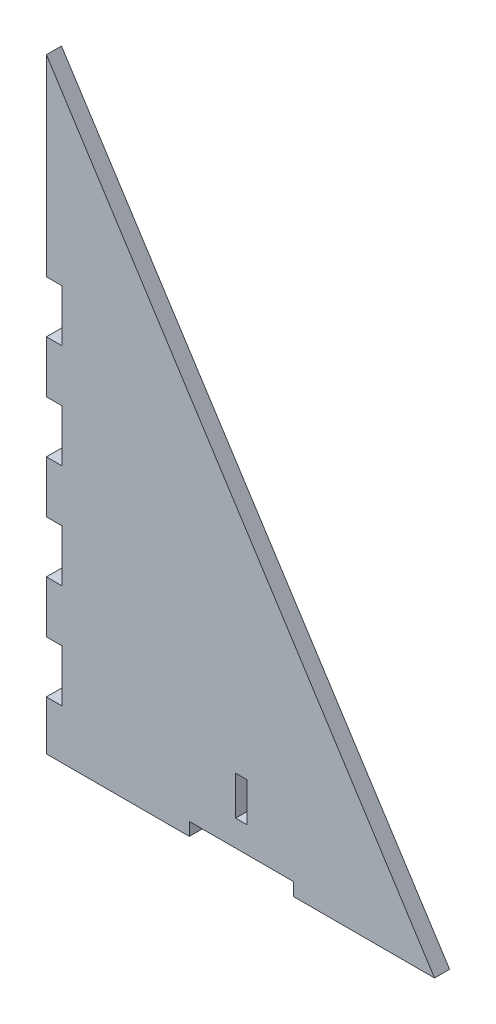
ISO-10303-21;
HEADER;
FILE_DESCRIPTION(('STEP AP214'),'2;1');
FILE_NAME('part.step','',(''),(''),'','','');
FILE_SCHEMA(('AUTOMOTIVE_DESIGN { 1 0 10303 214 1 1 1 1 }'));
ENDSEC;
DATA;
#1=APPLICATION_CONTEXT('core data for automotive mechanical design processes');
#2=APPLICATION_PROTOCOL_DEFINITION('international standard','automotive_design',2000,#1);
#3=PRODUCT_CONTEXT('',#1,'mechanical');
#4=PRODUCT('Part','Part','',(#3));
#5=PRODUCT_RELATED_PRODUCT_CATEGORY('part','',(#4));
#6=PRODUCT_DEFINITION_FORMATION('','',#4);
#7=PRODUCT_DEFINITION_CONTEXT('part definition',#1,'design');
#8=PRODUCT_DEFINITION('design','',#6,#7);
#9=PRODUCT_DEFINITION_SHAPE('','',#8);
#10=(LENGTH_UNIT() NAMED_UNIT(*) SI_UNIT(.MILLI.,.METRE.));
#11=(NAMED_UNIT(*) PLANE_ANGLE_UNIT() SI_UNIT($,.RADIAN.));
#12=(NAMED_UNIT(*) SI_UNIT($,.STERADIAN.) SOLID_ANGLE_UNIT());
#13=UNCERTAINTY_MEASURE_WITH_UNIT(LENGTH_MEASURE(1.E-05),#10,'distance_accuracy_value','');
#14=(GEOMETRIC_REPRESENTATION_CONTEXT(3) GLOBAL_UNCERTAINTY_ASSIGNED_CONTEXT((#13)) GLOBAL_UNIT_ASSIGNED_CONTEXT((#10,
#11,#12)) REPRESENTATION_CONTEXT('',''));
#15=CARTESIAN_POINT('',(0.,0.,0.));
#16=DIRECTION('',(0.,0.,1.));
#17=DIRECTION('',(1.,0.,0.));
#18=AXIS2_PLACEMENT_3D('',#15,#16,#17);
#19=CARTESIAN_POINT('',(0.,0.,251.28178504288));
#20=DIRECTION('',(0.,0.,-1.));
#21=DIRECTION('',(1.,0.,0.));
#22=AXIS2_PLACEMENT_3D('',#19,#20,#21);
#23=PLANE('',#22);
#24=DIRECTION('',(0.,1.,0.));
#25=VECTOR('',#24,1.);
#26=CARTESIAN_POINT('',(2.99999999999915,79.9999999999999,251.28178504288));
#27=LINE('',#26,#25);
#28=CARTESIAN_POINT('',(2.99999999999915,79.9999999999999,251.28178504288));
#29=VERTEX_POINT('',#28);
#30=CARTESIAN_POINT('',(2.99999999999916,117.006627670089,251.28178504288));
#31=VERTEX_POINT('',#30);
#32=EDGE_CURVE('E224',#29,#31,#27,.T.);
#33=ORIENTED_EDGE('',*,*,#32,.F.);
#34=DIRECTION('',(-1.,0.,0.));
#35=VECTOR('',#34,1.);
#36=CARTESIAN_POINT('',(5.99999999999914,79.9999999999999,251.28178504288));
#37=LINE('',#36,#35);
#38=CARTESIAN_POINT('',(5.99999999999914,79.9999999999999,251.28178504288));
#39=VERTEX_POINT('',#38);
#40=EDGE_CURVE('E236',#39,#29,#37,.T.);
#41=ORIENTED_EDGE('',*,*,#40,.F.);
#42=DIRECTION('',(0.,1.,0.));
#43=VECTOR('',#42,1.);
#44=CARTESIAN_POINT('',(5.99999999999914,69.9999999999999,251.28178504288));
#45=LINE('',#44,#43);
#46=CARTESIAN_POINT('',(5.99999999999914,69.9999999999999,251.28178504288));
#47=VERTEX_POINT('',#46);
#48=EDGE_CURVE('E211',#47,#39,#45,.T.);
#49=ORIENTED_EDGE('',*,*,#48,.F.);
#50=DIRECTION('',(1.,0.,0.));
#51=VECTOR('',#50,1.);
#52=CARTESIAN_POINT('',(5.99999999999914,69.9999999999999,251.28178504288));
#53=LINE('',#52,#51);
#54=CARTESIAN_POINT('',(2.99999999999915,69.9999999999999,251.28178504288));
#55=VERTEX_POINT('',#54);
#56=EDGE_CURVE('E344',#55,#47,#53,.T.);
#57=ORIENTED_EDGE('',*,*,#56,.F.);
#58=DIRECTION('',(0.,1.,0.));
#59=VECTOR('',#58,1.);
#60=CARTESIAN_POINT('',(2.99999999999915,59.9999999999999,251.28178504288));
#61=LINE('',#60,#59);
#62=CARTESIAN_POINT('',(2.99999999999915,59.9999999999999,251.28178504288));
#63=VERTEX_POINT('',#62);
#64=EDGE_CURVE('E341',#63,#55,#61,.T.);
#65=ORIENTED_EDGE('',*,*,#64,.F.);
#66=DIRECTION('',(-1.,0.,0.));
#67=VECTOR('',#66,1.);
#68=CARTESIAN_POINT('',(5.99999999999914,59.9999999999999,251.28178504288));
#69=LINE('',#68,#67);
#70=CARTESIAN_POINT('',(5.99999999999914,59.9999999999999,251.28178504288));
#71=VERTEX_POINT('',#70);
#72=EDGE_CURVE('E338',#71,#63,#69,.T.);
#73=ORIENTED_EDGE('',*,*,#72,.F.);
#74=DIRECTION('',(0.,1.,0.));
#75=VECTOR('',#74,1.);
#76=CARTESIAN_POINT('',(5.99999999999914,49.9999999999999,251.28178504288));
#77=LINE('',#76,#75);
#78=CARTESIAN_POINT('',(5.99999999999914,49.9999999999999,251.28178504288));
#79=VERTEX_POINT('',#78);
#80=EDGE_CURVE('E335',#79,#71,#77,.T.);
#81=ORIENTED_EDGE('',*,*,#80,.F.);
#82=DIRECTION('',(1.,0.,0.));
#83=VECTOR('',#82,1.);
#84=CARTESIAN_POINT('',(5.99999999999914,49.9999999999999,251.28178504288));
#85=LINE('',#84,#83);
#86=CARTESIAN_POINT('',(2.99999999999915,49.9999999999999,251.28178504288));
#87=VERTEX_POINT('',#86);
#88=EDGE_CURVE('E332',#87,#79,#85,.T.);
#89=ORIENTED_EDGE('',*,*,#88,.F.);
#90=DIRECTION('',(0.,1.,0.));
#91=VECTOR('',#90,1.);
#92=CARTESIAN_POINT('',(2.99999999999915,39.9999999999999,251.28178504288));
#93=LINE('',#92,#91);
#94=CARTESIAN_POINT('',(2.99999999999915,39.9999999999999,251.28178504288));
#95=VERTEX_POINT('',#94);
#96=EDGE_CURVE('E329',#95,#87,#93,.T.);
#97=ORIENTED_EDGE('',*,*,#96,.F.);
#98=DIRECTION('',(-1.,0.,0.));
#99=VECTOR('',#98,1.);
#100=CARTESIAN_POINT('',(5.99999999999914,39.9999999999999,251.28178504288));
#101=LINE('',#100,#99);
#102=CARTESIAN_POINT('',(5.99999999999914,39.9999999999999,251.28178504288));
#103=VERTEX_POINT('',#102);
#104=EDGE_CURVE('E326',#103,#95,#101,.T.);
#105=ORIENTED_EDGE('',*,*,#104,.F.);
#106=DIRECTION('',(0.,1.,0.));
#107=VECTOR('',#106,1.);
#108=CARTESIAN_POINT('',(5.99999999999914,29.9999999999999,251.28178504288));
#109=LINE('',#108,#107);
#110=CARTESIAN_POINT('',(5.99999999999914,29.9999999999999,251.28178504288));
#111=VERTEX_POINT('',#110);
#112=EDGE_CURVE('E323',#111,#103,#109,.T.);
#113=ORIENTED_EDGE('',*,*,#112,.F.);
#114=DIRECTION('',(1.,0.,0.));
#115=VECTOR('',#114,1.);
#116=CARTESIAN_POINT('',(5.99999999999914,29.9999999999999,251.28178504288));
#117=LINE('',#116,#115);
#118=CARTESIAN_POINT('',(2.99999999999914,29.9999999999998,251.28178504288));
#119=VERTEX_POINT('',#118);
#120=EDGE_CURVE('E320',#119,#111,#117,.T.);
#121=ORIENTED_EDGE('',*,*,#120,.F.);
#122=DIRECTION('',(0.,1.,0.));
#123=VECTOR('',#122,1.);
#124=CARTESIAN_POINT('',(2.99999999999914,19.9999999999999,251.28178504288));
#125=LINE('',#124,#123);
#126=CARTESIAN_POINT('',(2.99999999999914,19.9999999999999,251.28178504288));
#127=VERTEX_POINT('',#126);
#128=EDGE_CURVE('E317',#127,#119,#125,.T.);
#129=ORIENTED_EDGE('',*,*,#128,.F.);
#130=DIRECTION('',(-1.,0.,0.));
#131=VECTOR('',#130,1.);
#132=CARTESIAN_POINT('',(5.99999999999928,19.9999999999998,251.28178504288));
#133=LINE('',#132,#131);
#134=CARTESIAN_POINT('',(5.99999999999928,19.9999999999998,251.28178504288));
#135=VERTEX_POINT('',#134);
#136=EDGE_CURVE('E314',#135,#127,#133,.T.);
#137=ORIENTED_EDGE('',*,*,#136,.F.);
#138=DIRECTION('',(0.,1.,0.));
#139=VECTOR('',#138,1.);
#140=CARTESIAN_POINT('',(5.99999999999921,9.99999999999984,251.28178504288));
#141=LINE('',#140,#139);
#142=CARTESIAN_POINT('',(5.99999999999921,9.99999999999984,251.28178504288));
#143=VERTEX_POINT('',#142);
#144=EDGE_CURVE('E311',#143,#135,#141,.T.);
#145=ORIENTED_EDGE('',*,*,#144,.F.);
#146=DIRECTION('',(1.,0.,0.));
#147=VECTOR('',#146,1.);
#148=CARTESIAN_POINT('',(5.99999999999921,9.99999999999984,251.28178504288));
#149=LINE('',#148,#147);
#150=CARTESIAN_POINT('',(2.99999999999914,9.99999999999986,251.28178504288));
#151=VERTEX_POINT('',#150);
#152=EDGE_CURVE('E308',#151,#143,#149,.T.);
#153=ORIENTED_EDGE('',*,*,#152,.F.);
#154=DIRECTION('',(0.,1.,0.));
#155=VECTOR('',#154,1.);
#156=CARTESIAN_POINT('',(2.99999999999914,0.,251.28178504288));
#157=LINE('',#156,#155);
#158=CARTESIAN_POINT('',(2.99999999999914,0.5,251.28178504288));
#159=VERTEX_POINT('',#158);
#160=EDGE_CURVE('E281',#159,#151,#157,.T.);
#161=ORIENTED_EDGE('',*,*,#160,.F.);
#162=DIRECTION('',(-1.,0.,0.));
#163=VECTOR('',#162,1.);
#164=CARTESIAN_POINT('',(30.4999999999991,0.5,251.28178504288));
#165=LINE('',#164,#163);
#166=CARTESIAN_POINT('',(30.4999999999991,0.5,251.28178504288));
#167=VERTEX_POINT('',#166);
#168=EDGE_CURVE('E278',#167,#159,#165,.T.);
#169=ORIENTED_EDGE('',*,*,#168,.F.);
#170=DIRECTION('',(0.,-1.,0.));
#171=VECTOR('',#170,1.);
#172=CARTESIAN_POINT('',(30.4999999999991,0.,251.28178504288));
#173=LINE('',#172,#171);
#174=CARTESIAN_POINT('',(30.4999999999991,3.,251.28178504288));
#175=VERTEX_POINT('',#174);
#176=EDGE_CURVE('E282',#175,#167,#173,.T.);
#177=ORIENTED_EDGE('',*,*,#176,.F.);
#178=DIRECTION('',(-1.,0.,0.));
#179=VECTOR('',#178,1.);
#180=CARTESIAN_POINT('',(30.4999999999991,3.,251.28178504288));
#181=LINE('',#180,#179);
#182=CARTESIAN_POINT('',(50.4999999999991,3.,251.28178504288));
#183=VERTEX_POINT('',#182);
#184=EDGE_CURVE('E295',#183,#175,#181,.T.);
#185=ORIENTED_EDGE('',*,*,#184,.F.);
#186=DIRECTION('',(0.,1.,0.));
#187=VECTOR('',#186,1.);
#188=CARTESIAN_POINT('',(50.4999999999991,0.,251.28178504288));
#189=LINE('',#188,#187);
#190=CARTESIAN_POINT('',(50.4999999999991,0.499999999999998,251.28178504288));
#191=VERTEX_POINT('',#190);
#192=EDGE_CURVE('E290',#191,#183,#189,.T.);
#193=ORIENTED_EDGE('',*,*,#192,.F.);
#194=DIRECTION('',(-1.,0.,0.));
#195=VECTOR('',#194,1.);
#196=CARTESIAN_POINT('',(77.9999999999991,0.499999999999994,251.28178504288));
#197=LINE('',#196,#195);
#198=CARTESIAN_POINT('',(77.6795053344684,0.5,251.28178504288));
#199=VERTEX_POINT('',#198);
#200=EDGE_CURVE('E289',#199,#191,#197,.T.);
#201=ORIENTED_EDGE('',*,*,#200,.F.);
#202=DIRECTION('',(0.539644448367532,-0.841893027258275,0.));
#203=VECTOR('',#202,1.);
#204=CARTESIAN_POINT('',(2.99999999999916,117.006627670089,251.28178504288));
#205=LINE('',#204,#203);
#206=EDGE_CURVE('E291',#31,#199,#205,.T.);
#207=ORIENTED_EDGE('',*,*,#206,.F.);
#208=EDGE_LOOP('',(#33,#41,#49,#57,#65,#73,#81,#89,#97,#105,#113,#121,#129,#137,#145,#153,#161,
#169,#177,#185,#193,#201,#207));
#209=FACE_BOUND('',#208,.T.);
#210=DIRECTION('',(-1.,0.,0.));
#211=VECTOR('',#210,1.);
#212=CARTESIAN_POINT('',(39.3999999999991,8.,251.28178504288));
#213=LINE('',#212,#211);
#214=CARTESIAN_POINT('',(41.5999999999991,8.,251.28178504288));
#215=VERTEX_POINT('',#214);
#216=CARTESIAN_POINT('',(39.3999999999991,8.,251.28178504288));
#217=VERTEX_POINT('',#216);
#218=EDGE_CURVE('E716',#215,#217,#213,.T.);
#219=ORIENTED_EDGE('',*,*,#218,.T.);
#220=DIRECTION('',(0.,1.,0.));
#221=VECTOR('',#220,1.);
#222=CARTESIAN_POINT('',(39.3999999999991,8.,251.28178504288));
#223=LINE('',#222,#221);
#224=CARTESIAN_POINT('',(39.3999999999991,15.5,251.28178504288));
#225=VERTEX_POINT('',#224);
#226=EDGE_CURVE('E720',#217,#225,#223,.T.);
#227=ORIENTED_EDGE('',*,*,#226,.T.);
#228=DIRECTION('',(1.,0.,0.));
#229=VECTOR('',#228,1.);
#230=CARTESIAN_POINT('',(39.3999999999991,15.5,251.28178504288));
#231=LINE('',#230,#229);
#232=CARTESIAN_POINT('',(41.5999999999991,15.5,251.28178504288));
#233=VERTEX_POINT('',#232);
#234=EDGE_CURVE('E748',#225,#233,#231,.T.);
#235=ORIENTED_EDGE('',*,*,#234,.T.);
#236=DIRECTION('',(0.,-1.,0.));
#237=VECTOR('',#236,1.);
#238=CARTESIAN_POINT('',(41.5999999999991,8.,251.28178504288));
#239=LINE('',#238,#237);
#240=EDGE_CURVE('E727',#233,#215,#239,.T.);
#241=ORIENTED_EDGE('',*,*,#240,.T.);
#242=EDGE_LOOP('',(#219,#227,#235,#241));
#243=FACE_BOUND('',#242,.T.);
#244=ADVANCED_FACE('F34',(#209,#243),#23,.F.);
#245=CARTESIAN_POINT('',(0.,0.,248.381785042879));
#246=DIRECTION('',(0.,0.,-1.));
#247=DIRECTION('',(1.,0.,0.));
#248=AXIS2_PLACEMENT_3D('',#245,#246,#247);
#249=PLANE('',#248);
#250=DIRECTION('',(0.,1.,0.));
#251=VECTOR('',#250,1.);
#252=CARTESIAN_POINT('',(2.99999999999915,79.9999999999999,248.381785042879));
#253=LINE('',#252,#251);
#254=CARTESIAN_POINT('',(2.99999999999915,79.9999999999999,248.381785042879));
#255=VERTEX_POINT('',#254);
#256=CARTESIAN_POINT('',(2.99999999999916,117.006627670089,248.381785042879));
#257=VERTEX_POINT('',#256);
#258=EDGE_CURVE('E349',#255,#257,#253,.T.);
#259=ORIENTED_EDGE('',*,*,#258,.T.);
#260=DIRECTION('',(0.539644448367532,-0.841893027258275,0.));
#261=VECTOR('',#260,1.);
#262=CARTESIAN_POINT('',(2.99999999999916,117.006627670089,248.381785042879));
#263=LINE('',#262,#261);
#264=CARTESIAN_POINT('',(77.6795053344684,0.5,248.381785042879));
#265=VERTEX_POINT('',#264);
#266=EDGE_CURVE('E288',#257,#265,#263,.T.);
#267=ORIENTED_EDGE('',*,*,#266,.T.);
#268=DIRECTION('',(-1.,0.,0.));
#269=VECTOR('',#268,1.);
#270=CARTESIAN_POINT('',(77.9999999999991,0.499999999999994,248.381785042879));
#271=LINE('',#270,#269);
#272=CARTESIAN_POINT('',(50.4999999999991,0.499999999999998,248.381785042879));
#273=VERTEX_POINT('',#272);
#274=EDGE_CURVE('E284',#265,#273,#271,.T.);
#275=ORIENTED_EDGE('',*,*,#274,.T.);
#276=DIRECTION('',(0.,1.,0.));
#277=VECTOR('',#276,1.);
#278=CARTESIAN_POINT('',(50.4999999999991,0.,248.381785042879));
#279=LINE('',#278,#277);
#280=CARTESIAN_POINT('',(50.4999999999991,3.,248.381785042879));
#281=VERTEX_POINT('',#280);
#282=EDGE_CURVE('E287',#273,#281,#279,.T.);
#283=ORIENTED_EDGE('',*,*,#282,.T.);
#284=DIRECTION('',(-1.,0.,0.));
#285=VECTOR('',#284,1.);
#286=CARTESIAN_POINT('',(30.4999999999991,3.,248.381785042879));
#287=LINE('',#286,#285);
#288=CARTESIAN_POINT('',(30.4999999999991,3.,248.381785042879));
#289=VERTEX_POINT('',#288);
#290=EDGE_CURVE('E356',#281,#289,#287,.T.);
#291=ORIENTED_EDGE('',*,*,#290,.T.);
#292=DIRECTION('',(0.,-1.,0.));
#293=VECTOR('',#292,1.);
#294=CARTESIAN_POINT('',(30.4999999999991,0.,248.381785042879));
#295=LINE('',#294,#293);
#296=CARTESIAN_POINT('',(30.4999999999991,0.5,248.381785042879));
#297=VERTEX_POINT('',#296);
#298=EDGE_CURVE('E276',#289,#297,#295,.T.);
#299=ORIENTED_EDGE('',*,*,#298,.T.);
#300=DIRECTION('',(-1.,0.,0.));
#301=VECTOR('',#300,1.);
#302=CARTESIAN_POINT('',(30.4999999999991,0.5,248.381785042879));
#303=LINE('',#302,#301);
#304=CARTESIAN_POINT('',(2.99999999999914,0.5,248.381785042879));
#305=VERTEX_POINT('',#304);
#306=EDGE_CURVE('E272',#297,#305,#303,.T.);
#307=ORIENTED_EDGE('',*,*,#306,.T.);
#308=DIRECTION('',(0.,1.,0.));
#309=VECTOR('',#308,1.);
#310=CARTESIAN_POINT('',(2.99999999999914,0.,248.381785042879));
#311=LINE('',#310,#309);
#312=CARTESIAN_POINT('',(2.99999999999914,9.99999999999986,248.381785042879));
#313=VERTEX_POINT('',#312);
#314=EDGE_CURVE('E275',#305,#313,#311,.T.);
#315=ORIENTED_EDGE('',*,*,#314,.T.);
#316=DIRECTION('',(1.,0.,0.));
#317=VECTOR('',#316,1.);
#318=CARTESIAN_POINT('',(5.99999999999921,9.99999999999984,248.381785042879));
#319=LINE('',#318,#317);
#320=CARTESIAN_POINT('',(5.99999999999921,9.99999999999984,248.381785042879));
#321=VERTEX_POINT('',#320);
#322=EDGE_CURVE('E363',#313,#321,#319,.T.);
#323=ORIENTED_EDGE('',*,*,#322,.T.);
#324=DIRECTION('',(0.,1.,0.));
#325=VECTOR('',#324,1.);
#326=CARTESIAN_POINT('',(5.99999999999921,9.99999999999984,248.381785042879));
#327=LINE('',#326,#325);
#328=CARTESIAN_POINT('',(5.99999999999928,19.9999999999998,248.381785042879));
#329=VERTEX_POINT('',#328);
#330=EDGE_CURVE('E366',#321,#329,#327,.T.);
#331=ORIENTED_EDGE('',*,*,#330,.T.);
#332=DIRECTION('',(-1.,0.,0.));
#333=VECTOR('',#332,1.);
#334=CARTESIAN_POINT('',(5.99999999999928,19.9999999999998,248.381785042879));
#335=LINE('',#334,#333);
#336=CARTESIAN_POINT('',(2.99999999999914,19.9999999999999,248.381785042879));
#337=VERTEX_POINT('',#336);
#338=EDGE_CURVE('E369',#329,#337,#335,.T.);
#339=ORIENTED_EDGE('',*,*,#338,.T.);
#340=DIRECTION('',(0.,1.,0.));
#341=VECTOR('',#340,1.);
#342=CARTESIAN_POINT('',(2.99999999999914,19.9999999999999,248.381785042879));
#343=LINE('',#342,#341);
#344=CARTESIAN_POINT('',(2.99999999999914,29.9999999999998,248.381785042879));
#345=VERTEX_POINT('',#344);
#346=EDGE_CURVE('E372',#337,#345,#343,.T.);
#347=ORIENTED_EDGE('',*,*,#346,.T.);
#348=DIRECTION('',(1.,0.,0.));
#349=VECTOR('',#348,1.);
#350=CARTESIAN_POINT('',(5.99999999999914,29.9999999999999,248.381785042879));
#351=LINE('',#350,#349);
#352=CARTESIAN_POINT('',(5.99999999999914,29.9999999999999,248.381785042879));
#353=VERTEX_POINT('',#352);
#354=EDGE_CURVE('E375',#345,#353,#351,.T.);
#355=ORIENTED_EDGE('',*,*,#354,.T.);
#356=DIRECTION('',(0.,1.,0.));
#357=VECTOR('',#356,1.);
#358=CARTESIAN_POINT('',(5.99999999999914,29.9999999999999,248.381785042879));
#359=LINE('',#358,#357);
#360=CARTESIAN_POINT('',(5.99999999999914,39.9999999999999,248.381785042879));
#361=VERTEX_POINT('',#360);
#362=EDGE_CURVE('E378',#353,#361,#359,.T.);
#363=ORIENTED_EDGE('',*,*,#362,.T.);
#364=DIRECTION('',(-1.,0.,0.));
#365=VECTOR('',#364,1.);
#366=CARTESIAN_POINT('',(5.99999999999914,39.9999999999999,248.381785042879));
#367=LINE('',#366,#365);
#368=CARTESIAN_POINT('',(2.99999999999915,39.9999999999999,248.381785042879));
#369=VERTEX_POINT('',#368);
#370=EDGE_CURVE('E381',#361,#369,#367,.T.);
#371=ORIENTED_EDGE('',*,*,#370,.T.);
#372=DIRECTION('',(0.,1.,0.));
#373=VECTOR('',#372,1.);
#374=CARTESIAN_POINT('',(2.99999999999915,39.9999999999999,248.381785042879));
#375=LINE('',#374,#373);
#376=CARTESIAN_POINT('',(2.99999999999915,49.9999999999999,248.381785042879));
#377=VERTEX_POINT('',#376);
#378=EDGE_CURVE('E384',#369,#377,#375,.T.);
#379=ORIENTED_EDGE('',*,*,#378,.T.);
#380=DIRECTION('',(1.,0.,0.));
#381=VECTOR('',#380,1.);
#382=CARTESIAN_POINT('',(5.99999999999914,49.9999999999999,248.381785042879));
#383=LINE('',#382,#381);
#384=CARTESIAN_POINT('',(5.99999999999914,49.9999999999999,248.381785042879));
#385=VERTEX_POINT('',#384);
#386=EDGE_CURVE('E387',#377,#385,#383,.T.);
#387=ORIENTED_EDGE('',*,*,#386,.T.);
#388=DIRECTION('',(0.,1.,0.));
#389=VECTOR('',#388,1.);
#390=CARTESIAN_POINT('',(5.99999999999914,49.9999999999999,248.381785042879));
#391=LINE('',#390,#389);
#392=CARTESIAN_POINT('',(5.99999999999914,59.9999999999999,248.381785042879));
#393=VERTEX_POINT('',#392);
#394=EDGE_CURVE('E390',#385,#393,#391,.T.);
#395=ORIENTED_EDGE('',*,*,#394,.T.);
#396=DIRECTION('',(-1.,0.,0.));
#397=VECTOR('',#396,1.);
#398=CARTESIAN_POINT('',(5.99999999999914,59.9999999999999,248.381785042879));
#399=LINE('',#398,#397);
#400=CARTESIAN_POINT('',(2.99999999999915,59.9999999999999,248.381785042879));
#401=VERTEX_POINT('',#400);
#402=EDGE_CURVE('E393',#393,#401,#399,.T.);
#403=ORIENTED_EDGE('',*,*,#402,.T.);
#404=DIRECTION('',(0.,1.,0.));
#405=VECTOR('',#404,1.);
#406=CARTESIAN_POINT('',(2.99999999999915,59.9999999999999,248.381785042879));
#407=LINE('',#406,#405);
#408=CARTESIAN_POINT('',(2.99999999999915,69.9999999999999,248.381785042879));
#409=VERTEX_POINT('',#408);
#410=EDGE_CURVE('E232',#401,#409,#407,.T.);
#411=ORIENTED_EDGE('',*,*,#410,.T.);
#412=DIRECTION('',(1.,0.,0.));
#413=VECTOR('',#412,1.);
#414=CARTESIAN_POINT('',(5.99999999999914,69.9999999999999,248.381785042879));
#415=LINE('',#414,#413);
#416=CARTESIAN_POINT('',(5.99999999999914,69.9999999999999,248.381785042879));
#417=VERTEX_POINT('',#416);
#418=EDGE_CURVE('E230',#409,#417,#415,.T.);
#419=ORIENTED_EDGE('',*,*,#418,.T.);
#420=DIRECTION('',(0.,1.,0.));
#421=VECTOR('',#420,1.);
#422=CARTESIAN_POINT('',(5.99999999999914,69.9999999999999,248.381785042879));
#423=LINE('',#422,#421);
#424=CARTESIAN_POINT('',(5.99999999999914,79.9999999999999,248.381785042879));
#425=VERTEX_POINT('',#424);
#426=EDGE_CURVE('E208',#417,#425,#423,.T.);
#427=ORIENTED_EDGE('',*,*,#426,.T.);
#428=DIRECTION('',(-1.,0.,0.));
#429=VECTOR('',#428,1.);
#430=CARTESIAN_POINT('',(5.99999999999914,79.9999999999999,248.381785042879));
#431=LINE('',#430,#429);
#432=EDGE_CURVE('E219',#425,#255,#431,.T.);
#433=ORIENTED_EDGE('',*,*,#432,.T.);
#434=EDGE_LOOP('',(#259,#267,#275,#283,#291,#299,#307,#315,#323,#331,#339,#347,#355,#363,#371,
#379,#387,#395,#403,#411,#419,#427,#433));
#435=FACE_BOUND('',#434,.T.);
#436=DIRECTION('',(0.,-1.,0.));
#437=VECTOR('',#436,1.);
#438=CARTESIAN_POINT('',(41.5999999999991,8.,248.381785042879));
#439=LINE('',#438,#437);
#440=CARTESIAN_POINT('',(41.5999999999991,15.5,248.381785042879));
#441=VERTEX_POINT('',#440);
#442=CARTESIAN_POINT('',(41.5999999999991,8.,248.381785042879));
#443=VERTEX_POINT('',#442);
#444=EDGE_CURVE('E711',#441,#443,#439,.T.);
#445=ORIENTED_EDGE('',*,*,#444,.F.);
#446=DIRECTION('',(1.,0.,0.));
#447=VECTOR('',#446,1.);
#448=CARTESIAN_POINT('',(39.3999999999991,15.5,248.381785042879));
#449=LINE('',#448,#447);
#450=CARTESIAN_POINT('',(39.3999999999991,15.5,248.381785042879));
#451=VERTEX_POINT('',#450);
#452=EDGE_CURVE('E717',#451,#441,#449,.T.);
#453=ORIENTED_EDGE('',*,*,#452,.F.);
#454=DIRECTION('',(0.,1.,0.));
#455=VECTOR('',#454,1.);
#456=CARTESIAN_POINT('',(39.3999999999991,8.,248.381785042879));
#457=LINE('',#456,#455);
#458=CARTESIAN_POINT('',(39.3999999999991,8.,248.381785042879));
#459=VERTEX_POINT('',#458);
#460=EDGE_CURVE('E722',#459,#451,#457,.T.);
#461=ORIENTED_EDGE('',*,*,#460,.F.);
#462=DIRECTION('',(-1.,0.,0.));
#463=VECTOR('',#462,1.);
#464=CARTESIAN_POINT('',(39.3999999999991,8.,248.381785042879));
#465=LINE('',#464,#463);
#466=EDGE_CURVE('E744',#443,#459,#465,.T.);
#467=ORIENTED_EDGE('',*,*,#466,.F.);
#468=EDGE_LOOP('',(#445,#453,#461,#467));
#469=FACE_BOUND('',#468,.T.);
#470=ADVANCED_FACE('F226',(#435,#469),#249,.T.);
#471=CARTESIAN_POINT('',(2.99999999999915,79.9999999999999,251.28178504288));
#472=DIRECTION('',(1.,0.,0.));
#473=DIRECTION('',(0.,1.,0.));
#474=AXIS2_PLACEMENT_3D('',#471,#472,#473);
#475=PLANE('',#474);
#476=ORIENTED_EDGE('',*,*,#258,.F.);
#477=DIRECTION('',(0.,0.,-1.));
#478=VECTOR('',#477,1.);
#479=CARTESIAN_POINT('',(2.99999999999915,79.9999999999999,251.28178504288));
#480=LINE('',#479,#478);
#481=EDGE_CURVE('E216',#29,#255,#480,.T.);
#482=ORIENTED_EDGE('',*,*,#481,.F.);
#483=ORIENTED_EDGE('',*,*,#32,.T.);
#484=DIRECTION('',(0.,0.,-1.));
#485=VECTOR('',#484,1.);
#486=CARTESIAN_POINT('',(2.99999999999916,117.006627670089,251.28178504288));
#487=LINE('',#486,#485);
#488=EDGE_CURVE('E12',#31,#257,#487,.T.);
#489=ORIENTED_EDGE('',*,*,#488,.T.);
#490=EDGE_LOOP('',(#476,#482,#483,#489));
#491=FACE_BOUND('',#490,.T.);
#492=ADVANCED_FACE('F407',(#491),#475,.F.);
#493=CARTESIAN_POINT('',(2.99999999999916,117.006627670089,251.28178504288));
#494=DIRECTION('',(-0.841893027258275,-0.539644448367532,0.));
#495=DIRECTION('',(0.539644448367532,-0.841893027258275,0.));
#496=AXIS2_PLACEMENT_3D('',#493,#494,#495);
#497=PLANE('',#496);
#498=ORIENTED_EDGE('',*,*,#266,.F.);
#499=ORIENTED_EDGE('',*,*,#488,.F.);
#500=ORIENTED_EDGE('',*,*,#206,.T.);
#501=DIRECTION('',(0.,0.,-1.));
#502=VECTOR('',#501,1.);
#503=CARTESIAN_POINT('',(77.6795053344684,0.5,251.28178504288));
#504=LINE('',#503,#502);
#505=EDGE_CURVE('E38',#199,#265,#504,.T.);
#506=ORIENTED_EDGE('',*,*,#505,.T.);
#507=EDGE_LOOP('',(#498,#499,#500,#506));
#508=FACE_BOUND('',#507,.T.);
#509=ADVANCED_FACE('F408',(#508),#497,.F.);
#510=CARTESIAN_POINT('',(77.9999999999991,0.499999999999994,251.28178504288));
#511=DIRECTION('',(0.,1.,0.));
#512=DIRECTION('',(-1.,0.,0.));
#513=AXIS2_PLACEMENT_3D('',#510,#511,#512);
#514=PLANE('',#513);
#515=ORIENTED_EDGE('',*,*,#274,.F.);
#516=ORIENTED_EDGE('',*,*,#505,.F.);
#517=ORIENTED_EDGE('',*,*,#200,.T.);
#518=DIRECTION('',(0.,0.,-1.));
#519=VECTOR('',#518,1.);
#520=CARTESIAN_POINT('',(50.4999999999991,0.499999999999998,251.28178504288));
#521=LINE('',#520,#519);
#522=EDGE_CURVE('E270',#191,#273,#521,.T.);
#523=ORIENTED_EDGE('',*,*,#522,.T.);
#524=EDGE_LOOP('',(#515,#516,#517,#523));
#525=FACE_BOUND('',#524,.T.);
#526=ADVANCED_FACE('F36',(#525),#514,.F.);
#527=CARTESIAN_POINT('',(50.4999999999991,0.,251.28178504288));
#528=DIRECTION('',(1.,0.,0.));
#529=DIRECTION('',(0.,0.,1.));
#530=AXIS2_PLACEMENT_3D('',#527,#528,#529);
#531=PLANE('',#530);
#532=ORIENTED_EDGE('',*,*,#282,.F.);
#533=ORIENTED_EDGE('',*,*,#522,.F.);
#534=ORIENTED_EDGE('',*,*,#192,.T.);
#535=DIRECTION('',(0.,0.,-1.));
#536=VECTOR('',#535,1.);
#537=CARTESIAN_POINT('',(50.4999999999991,3.,251.28178504288));
#538=LINE('',#537,#536);
#539=EDGE_CURVE('E268',#183,#281,#538,.T.);
#540=ORIENTED_EDGE('',*,*,#539,.T.);
#541=EDGE_LOOP('',(#532,#533,#534,#540));
#542=FACE_BOUND('',#541,.T.);
#543=ADVANCED_FACE('F411',(#542),#531,.F.);
#544=CARTESIAN_POINT('',(30.4999999999991,3.,251.28178504288));
#545=DIRECTION('',(0.,1.,0.));
#546=DIRECTION('',(-1.,0.,0.));
#547=AXIS2_PLACEMENT_3D('',#544,#545,#546);
#548=PLANE('',#547);
#549=ORIENTED_EDGE('',*,*,#290,.F.);
#550=ORIENTED_EDGE('',*,*,#539,.F.);
#551=ORIENTED_EDGE('',*,*,#184,.T.);
#552=DIRECTION('',(0.,0.,-1.));
#553=VECTOR('',#552,1.);
#554=CARTESIAN_POINT('',(30.4999999999991,3.,251.28178504288));
#555=LINE('',#554,#553);
#556=EDGE_CURVE('E266',#175,#289,#555,.T.);
#557=ORIENTED_EDGE('',*,*,#556,.T.);
#558=EDGE_LOOP('',(#549,#550,#551,#557));
#559=FACE_BOUND('',#558,.T.);
#560=ADVANCED_FACE('F415',(#559),#548,.F.);
#561=CARTESIAN_POINT('',(30.4999999999991,0.,251.28178504288));
#562=DIRECTION('',(-1.,0.,0.));
#563=DIRECTION('',(0.,-1.,0.));
#564=AXIS2_PLACEMENT_3D('',#561,#562,#563);
#565=PLANE('',#564);
#566=ORIENTED_EDGE('',*,*,#298,.F.);
#567=ORIENTED_EDGE('',*,*,#556,.F.);
#568=ORIENTED_EDGE('',*,*,#176,.T.);
#569=DIRECTION('',(0.,0.,-1.));
#570=VECTOR('',#569,1.);
#571=CARTESIAN_POINT('',(30.4999999999991,0.5,251.28178504288));
#572=LINE('',#571,#570);
#573=EDGE_CURVE('E269',#167,#297,#572,.T.);
#574=ORIENTED_EDGE('',*,*,#573,.T.);
#575=EDGE_LOOP('',(#566,#567,#568,#574));
#576=FACE_BOUND('',#575,.T.);
#577=ADVANCED_FACE('F419',(#576),#565,.F.);
#578=CARTESIAN_POINT('',(30.4999999999991,0.5,251.28178504288));
#579=DIRECTION('',(0.,1.,0.));
#580=DIRECTION('',(-1.,0.,0.));
#581=AXIS2_PLACEMENT_3D('',#578,#579,#580);
#582=PLANE('',#581);
#583=ORIENTED_EDGE('',*,*,#306,.F.);
#584=ORIENTED_EDGE('',*,*,#573,.F.);
#585=ORIENTED_EDGE('',*,*,#168,.T.);
#586=DIRECTION('',(0.,0.,-1.));
#587=VECTOR('',#586,1.);
#588=CARTESIAN_POINT('',(2.99999999999914,0.5,251.28178504288));
#589=LINE('',#588,#587);
#590=EDGE_CURVE('E265',#159,#305,#589,.T.);
#591=ORIENTED_EDGE('',*,*,#590,.T.);
#592=EDGE_LOOP('',(#583,#584,#585,#591));
#593=FACE_BOUND('',#592,.T.);
#594=ADVANCED_FACE('F423',(#593),#582,.F.);
#595=CARTESIAN_POINT('',(2.99999999999914,0.,251.28178504288));
#596=DIRECTION('',(1.,0.,0.));
#597=DIRECTION('',(0.,1.,0.));
#598=AXIS2_PLACEMENT_3D('',#595,#596,#597);
#599=PLANE('',#598);
#600=ORIENTED_EDGE('',*,*,#314,.F.);
#601=ORIENTED_EDGE('',*,*,#590,.F.);
#602=ORIENTED_EDGE('',*,*,#160,.T.);
#603=DIRECTION('',(0.,0.,-1.));
#604=VECTOR('',#603,1.);
#605=CARTESIAN_POINT('',(2.99999999999914,9.99999999999986,251.28178504288));
#606=LINE('',#605,#604);
#607=EDGE_CURVE('E263',#151,#313,#606,.T.);
#608=ORIENTED_EDGE('',*,*,#607,.T.);
#609=EDGE_LOOP('',(#600,#601,#602,#608));
#610=FACE_BOUND('',#609,.T.);
#611=ADVANCED_FACE('F427',(#610),#599,.F.);
#612=CARTESIAN_POINT('',(5.99999999999921,9.99999999999984,251.28178504288));
#613=DIRECTION('',(0.,-1.,0.));
#614=DIRECTION('',(1.,0.,0.));
#615=AXIS2_PLACEMENT_3D('',#612,#613,#614);
#616=PLANE('',#615);
#617=ORIENTED_EDGE('',*,*,#322,.F.);
#618=ORIENTED_EDGE('',*,*,#607,.F.);
#619=ORIENTED_EDGE('',*,*,#152,.T.);
#620=DIRECTION('',(0.,0.,-1.));
#621=VECTOR('',#620,1.);
#622=CARTESIAN_POINT('',(5.99999999999921,9.99999999999984,251.28178504288));
#623=LINE('',#622,#621);
#624=EDGE_CURVE('E261',#143,#321,#623,.T.);
#625=ORIENTED_EDGE('',*,*,#624,.T.);
#626=EDGE_LOOP('',(#617,#618,#619,#625));
#627=FACE_BOUND('',#626,.T.);
#628=ADVANCED_FACE('F431',(#627),#616,.F.);
#629=CARTESIAN_POINT('',(5.99999999999921,9.99999999999984,251.28178504288));
#630=DIRECTION('',(1.,0.,0.));
#631=DIRECTION('',(0.,1.,0.));
#632=AXIS2_PLACEMENT_3D('',#629,#630,#631);
#633=PLANE('',#632);
#634=ORIENTED_EDGE('',*,*,#330,.F.);
#635=ORIENTED_EDGE('',*,*,#624,.F.);
#636=ORIENTED_EDGE('',*,*,#144,.T.);
#637=DIRECTION('',(0.,0.,-1.));
#638=VECTOR('',#637,1.);
#639=CARTESIAN_POINT('',(5.99999999999928,19.9999999999998,251.28178504288));
#640=LINE('',#639,#638);
#641=EDGE_CURVE('E259',#135,#329,#640,.T.);
#642=ORIENTED_EDGE('',*,*,#641,.T.);
#643=EDGE_LOOP('',(#634,#635,#636,#642));
#644=FACE_BOUND('',#643,.T.);
#645=ADVANCED_FACE('F435',(#644),#633,.F.);
#646=CARTESIAN_POINT('',(5.99999999999928,19.9999999999998,251.28178504288));
#647=DIRECTION('',(0.,1.,0.));
#648=DIRECTION('',(-1.,0.,0.));
#649=AXIS2_PLACEMENT_3D('',#646,#647,#648);
#650=PLANE('',#649);
#651=ORIENTED_EDGE('',*,*,#338,.F.);
#652=ORIENTED_EDGE('',*,*,#641,.F.);
#653=ORIENTED_EDGE('',*,*,#136,.T.);
#654=DIRECTION('',(0.,0.,-1.));
#655=VECTOR('',#654,1.);
#656=CARTESIAN_POINT('',(2.99999999999914,19.9999999999999,251.28178504288));
#657=LINE('',#656,#655);
#658=EDGE_CURVE('E257',#127,#337,#657,.T.);
#659=ORIENTED_EDGE('',*,*,#658,.T.);
#660=EDGE_LOOP('',(#651,#652,#653,#659));
#661=FACE_BOUND('',#660,.T.);
#662=ADVANCED_FACE('F439',(#661),#650,.F.);
#663=CARTESIAN_POINT('',(2.99999999999914,19.9999999999999,251.28178504288));
#664=DIRECTION('',(1.,0.,0.));
#665=DIRECTION('',(0.,1.,0.));
#666=AXIS2_PLACEMENT_3D('',#663,#664,#665);
#667=PLANE('',#666);
#668=ORIENTED_EDGE('',*,*,#346,.F.);
#669=ORIENTED_EDGE('',*,*,#658,.F.);
#670=ORIENTED_EDGE('',*,*,#128,.T.);
#671=DIRECTION('',(0.,0.,-1.));
#672=VECTOR('',#671,1.);
#673=CARTESIAN_POINT('',(2.99999999999914,29.9999999999998,251.28178504288));
#674=LINE('',#673,#672);
#675=EDGE_CURVE('E255',#119,#345,#674,.T.);
#676=ORIENTED_EDGE('',*,*,#675,.T.);
#677=EDGE_LOOP('',(#668,#669,#670,#676));
#678=FACE_BOUND('',#677,.T.);
#679=ADVANCED_FACE('F443',(#678),#667,.F.);
#680=CARTESIAN_POINT('',(5.99999999999914,29.9999999999999,251.28178504288));
#681=DIRECTION('',(0.,-1.,0.));
#682=DIRECTION('',(1.,0.,0.));
#683=AXIS2_PLACEMENT_3D('',#680,#681,#682);
#684=PLANE('',#683);
#685=ORIENTED_EDGE('',*,*,#354,.F.);
#686=ORIENTED_EDGE('',*,*,#675,.F.);
#687=ORIENTED_EDGE('',*,*,#120,.T.);
#688=DIRECTION('',(0.,0.,-1.));
#689=VECTOR('',#688,1.);
#690=CARTESIAN_POINT('',(5.99999999999914,29.9999999999999,251.28178504288));
#691=LINE('',#690,#689);
#692=EDGE_CURVE('E253',#111,#353,#691,.T.);
#693=ORIENTED_EDGE('',*,*,#692,.T.);
#694=EDGE_LOOP('',(#685,#686,#687,#693));
#695=FACE_BOUND('',#694,.T.);
#696=ADVANCED_FACE('F447',(#695),#684,.F.);
#697=CARTESIAN_POINT('',(5.99999999999914,29.9999999999999,251.28178504288));
#698=DIRECTION('',(1.,0.,0.));
#699=DIRECTION('',(0.,0.,1.));
#700=AXIS2_PLACEMENT_3D('',#697,#698,#699);
#701=PLANE('',#700);
#702=ORIENTED_EDGE('',*,*,#362,.F.);
#703=ORIENTED_EDGE('',*,*,#692,.F.);
#704=ORIENTED_EDGE('',*,*,#112,.T.);
#705=DIRECTION('',(0.,0.,-1.));
#706=VECTOR('',#705,1.);
#707=CARTESIAN_POINT('',(5.99999999999914,39.9999999999999,251.28178504288));
#708=LINE('',#707,#706);
#709=EDGE_CURVE('E251',#103,#361,#708,.T.);
#710=ORIENTED_EDGE('',*,*,#709,.T.);
#711=EDGE_LOOP('',(#702,#703,#704,#710));
#712=FACE_BOUND('',#711,.T.);
#713=ADVANCED_FACE('F451',(#712),#701,.F.);
#714=CARTESIAN_POINT('',(5.99999999999914,39.9999999999999,251.28178504288));
#715=DIRECTION('',(0.,1.,0.));
#716=DIRECTION('',(-1.,0.,0.));
#717=AXIS2_PLACEMENT_3D('',#714,#715,#716);
#718=PLANE('',#717);
#719=ORIENTED_EDGE('',*,*,#370,.F.);
#720=ORIENTED_EDGE('',*,*,#709,.F.);
#721=ORIENTED_EDGE('',*,*,#104,.T.);
#722=DIRECTION('',(0.,0.,-1.));
#723=VECTOR('',#722,1.);
#724=CARTESIAN_POINT('',(2.99999999999915,39.9999999999999,251.28178504288));
#725=LINE('',#724,#723);
#726=EDGE_CURVE('E249',#95,#369,#725,.T.);
#727=ORIENTED_EDGE('',*,*,#726,.T.);
#728=EDGE_LOOP('',(#719,#720,#721,#727));
#729=FACE_BOUND('',#728,.T.);
#730=ADVANCED_FACE('F455',(#729),#718,.F.);
#731=CARTESIAN_POINT('',(2.99999999999915,39.9999999999999,251.28178504288));
#732=DIRECTION('',(1.,0.,0.));
#733=DIRECTION('',(0.,1.,0.));
#734=AXIS2_PLACEMENT_3D('',#731,#732,#733);
#735=PLANE('',#734);
#736=ORIENTED_EDGE('',*,*,#378,.F.);
#737=ORIENTED_EDGE('',*,*,#726,.F.);
#738=ORIENTED_EDGE('',*,*,#96,.T.);
#739=DIRECTION('',(0.,0.,-1.));
#740=VECTOR('',#739,1.);
#741=CARTESIAN_POINT('',(2.99999999999915,49.9999999999999,251.28178504288));
#742=LINE('',#741,#740);
#743=EDGE_CURVE('E247',#87,#377,#742,.T.);
#744=ORIENTED_EDGE('',*,*,#743,.T.);
#745=EDGE_LOOP('',(#736,#737,#738,#744));
#746=FACE_BOUND('',#745,.T.);
#747=ADVANCED_FACE('F459',(#746),#735,.F.);
#748=CARTESIAN_POINT('',(5.99999999999914,49.9999999999999,251.28178504288));
#749=DIRECTION('',(0.,-1.,0.));
#750=DIRECTION('',(1.,0.,0.));
#751=AXIS2_PLACEMENT_3D('',#748,#749,#750);
#752=PLANE('',#751);
#753=ORIENTED_EDGE('',*,*,#386,.F.);
#754=ORIENTED_EDGE('',*,*,#743,.F.);
#755=ORIENTED_EDGE('',*,*,#88,.T.);
#756=DIRECTION('',(0.,0.,-1.));
#757=VECTOR('',#756,1.);
#758=CARTESIAN_POINT('',(5.99999999999914,49.9999999999999,251.28178504288));
#759=LINE('',#758,#757);
#760=EDGE_CURVE('E245',#79,#385,#759,.T.);
#761=ORIENTED_EDGE('',*,*,#760,.T.);
#762=EDGE_LOOP('',(#753,#754,#755,#761));
#763=FACE_BOUND('',#762,.T.);
#764=ADVANCED_FACE('F463',(#763),#752,.F.);
#765=CARTESIAN_POINT('',(5.99999999999914,49.9999999999999,251.28178504288));
#766=DIRECTION('',(1.,0.,0.));
#767=DIRECTION('',(0.,0.,1.));
#768=AXIS2_PLACEMENT_3D('',#765,#766,#767);
#769=PLANE('',#768);
#770=ORIENTED_EDGE('',*,*,#394,.F.);
#771=ORIENTED_EDGE('',*,*,#760,.F.);
#772=ORIENTED_EDGE('',*,*,#80,.T.);
#773=DIRECTION('',(0.,0.,-1.));
#774=VECTOR('',#773,1.);
#775=CARTESIAN_POINT('',(5.99999999999914,59.9999999999999,251.28178504288));
#776=LINE('',#775,#774);
#777=EDGE_CURVE('E243',#71,#393,#776,.T.);
#778=ORIENTED_EDGE('',*,*,#777,.T.);
#779=EDGE_LOOP('',(#770,#771,#772,#778));
#780=FACE_BOUND('',#779,.T.);
#781=ADVANCED_FACE('F467',(#780),#769,.F.);
#782=CARTESIAN_POINT('',(5.99999999999914,59.9999999999999,251.28178504288));
#783=DIRECTION('',(0.,1.,0.));
#784=DIRECTION('',(-1.,0.,0.));
#785=AXIS2_PLACEMENT_3D('',#782,#783,#784);
#786=PLANE('',#785);
#787=ORIENTED_EDGE('',*,*,#402,.F.);
#788=ORIENTED_EDGE('',*,*,#777,.F.);
#789=ORIENTED_EDGE('',*,*,#72,.T.);
#790=DIRECTION('',(0.,0.,-1.));
#791=VECTOR('',#790,1.);
#792=CARTESIAN_POINT('',(2.99999999999915,59.9999999999999,251.28178504288));
#793=LINE('',#792,#791);
#794=EDGE_CURVE('E241',#63,#401,#793,.T.);
#795=ORIENTED_EDGE('',*,*,#794,.T.);
#796=EDGE_LOOP('',(#787,#788,#789,#795));
#797=FACE_BOUND('',#796,.T.);
#798=ADVANCED_FACE('F470',(#797),#786,.F.);
#799=CARTESIAN_POINT('',(2.99999999999915,59.9999999999999,251.28178504288));
#800=DIRECTION('',(1.,0.,0.));
#801=DIRECTION('',(0.,1.,0.));
#802=AXIS2_PLACEMENT_3D('',#799,#800,#801);
#803=PLANE('',#802);
#804=ORIENTED_EDGE('',*,*,#410,.F.);
#805=ORIENTED_EDGE('',*,*,#794,.F.);
#806=ORIENTED_EDGE('',*,*,#64,.T.);
#807=DIRECTION('',(0.,0.,-1.));
#808=VECTOR('',#807,1.);
#809=CARTESIAN_POINT('',(2.99999999999915,69.9999999999999,251.28178504288));
#810=LINE('',#809,#808);
#811=EDGE_CURVE('E239',#55,#409,#810,.T.);
#812=ORIENTED_EDGE('',*,*,#811,.T.);
#813=EDGE_LOOP('',(#804,#805,#806,#812));
#814=FACE_BOUND('',#813,.T.);
#815=ADVANCED_FACE('F398',(#814),#803,.F.);
#816=CARTESIAN_POINT('',(5.99999999999914,69.9999999999999,251.28178504288));
#817=DIRECTION('',(0.,-1.,0.));
#818=DIRECTION('',(1.,0.,0.));
#819=AXIS2_PLACEMENT_3D('',#816,#817,#818);
#820=PLANE('',#819);
#821=ORIENTED_EDGE('',*,*,#418,.F.);
#822=ORIENTED_EDGE('',*,*,#811,.F.);
#823=ORIENTED_EDGE('',*,*,#56,.T.);
#824=DIRECTION('',(0.,0.,-1.));
#825=VECTOR('',#824,1.);
#826=CARTESIAN_POINT('',(5.99999999999914,69.9999999999999,251.28178504288));
#827=LINE('',#826,#825);
#828=EDGE_CURVE('E215',#47,#417,#827,.T.);
#829=ORIENTED_EDGE('',*,*,#828,.T.);
#830=EDGE_LOOP('',(#821,#822,#823,#829));
#831=FACE_BOUND('',#830,.T.);
#832=ADVANCED_FACE('F402',(#831),#820,.F.);
#833=CARTESIAN_POINT('',(5.99999999999914,69.9999999999999,251.28178504288));
#834=DIRECTION('',(1.,0.,0.));
#835=DIRECTION('',(0.,0.,1.));
#836=AXIS2_PLACEMENT_3D('',#833,#834,#835);
#837=PLANE('',#836);
#838=ORIENTED_EDGE('',*,*,#426,.F.);
#839=ORIENTED_EDGE('',*,*,#828,.F.);
#840=ORIENTED_EDGE('',*,*,#48,.T.);
#841=DIRECTION('',(0.,0.,-1.));
#842=VECTOR('',#841,1.);
#843=CARTESIAN_POINT('',(5.99999999999914,79.9999999999999,251.28178504288));
#844=LINE('',#843,#842);
#845=EDGE_CURVE('E204',#39,#425,#844,.T.);
#846=ORIENTED_EDGE('',*,*,#845,.T.);
#847=EDGE_LOOP('',(#838,#839,#840,#846));
#848=FACE_BOUND('',#847,.T.);
#849=ADVANCED_FACE('F206',(#848),#837,.F.);
#850=CARTESIAN_POINT('',(5.99999999999914,79.9999999999999,251.28178504288));
#851=DIRECTION('',(0.,1.,0.));
#852=DIRECTION('',(-1.,0.,0.));
#853=AXIS2_PLACEMENT_3D('',#850,#851,#852);
#854=PLANE('',#853);
#855=ORIENTED_EDGE('',*,*,#432,.F.);
#856=ORIENTED_EDGE('',*,*,#845,.F.);
#857=ORIENTED_EDGE('',*,*,#40,.T.);
#858=ORIENTED_EDGE('',*,*,#481,.T.);
#859=EDGE_LOOP('',(#855,#856,#857,#858));
#860=FACE_BOUND('',#859,.T.);
#861=ADVANCED_FACE('F220',(#860),#854,.F.);
#862=CARTESIAN_POINT('',(39.3999999999991,8.,251.28178504288));
#863=DIRECTION('',(0.,1.,0.));
#864=DIRECTION('',(0.,0.,-1.));
#865=AXIS2_PLACEMENT_3D('',#862,#863,#864);
#866=PLANE('',#865);
#867=ORIENTED_EDGE('',*,*,#466,.T.);
#868=DIRECTION('',(0.,0.,-1.));
#869=VECTOR('',#868,1.);
#870=CARTESIAN_POINT('',(39.3999999999991,8.,251.28178504288));
#871=LINE('',#870,#869);
#872=EDGE_CURVE('E351',#217,#459,#871,.T.);
#873=ORIENTED_EDGE('',*,*,#872,.F.);
#874=ORIENTED_EDGE('',*,*,#218,.F.);
#875=DIRECTION('',(0.,0.,-1.));
#876=VECTOR('',#875,1.);
#877=CARTESIAN_POINT('',(41.5999999999991,8.,251.28178504288));
#878=LINE('',#877,#876);
#879=EDGE_CURVE('E712',#215,#443,#878,.T.);
#880=ORIENTED_EDGE('',*,*,#879,.T.);
#881=EDGE_LOOP('',(#867,#873,#874,#880));
#882=FACE_BOUND('',#881,.T.);
#883=ADVANCED_FACE('F486',(#882),#866,.T.);
#884=CARTESIAN_POINT('',(39.3999999999991,8.,251.28178504288));
#885=DIRECTION('',(1.,0.,0.));
#886=DIRECTION('',(0.,0.,1.));
#887=AXIS2_PLACEMENT_3D('',#884,#885,#886);
#888=PLANE('',#887);
#889=ORIENTED_EDGE('',*,*,#460,.T.);
#890=DIRECTION('',(0.,0.,-1.));
#891=VECTOR('',#890,1.);
#892=CARTESIAN_POINT('',(39.3999999999991,15.5,251.28178504288));
#893=LINE('',#892,#891);
#894=EDGE_CURVE('E729',#225,#451,#893,.T.);
#895=ORIENTED_EDGE('',*,*,#894,.F.);
#896=ORIENTED_EDGE('',*,*,#226,.F.);
#897=ORIENTED_EDGE('',*,*,#872,.T.);
#898=EDGE_LOOP('',(#889,#895,#896,#897));
#899=FACE_BOUND('',#898,.T.);
#900=ADVANCED_FACE('F512',(#899),#888,.T.);
#901=CARTESIAN_POINT('',(39.3999999999991,15.5,251.28178504288));
#902=DIRECTION('',(0.,-1.,0.));
#903=DIRECTION('',(0.,0.,1.));
#904=AXIS2_PLACEMENT_3D('',#901,#902,#903);
#905=PLANE('',#904);
#906=ORIENTED_EDGE('',*,*,#452,.T.);
#907=DIRECTION('',(0.,0.,-1.));
#908=VECTOR('',#907,1.);
#909=CARTESIAN_POINT('',(41.5999999999991,15.5,251.28178504288));
#910=LINE('',#909,#908);
#911=EDGE_CURVE('E52',#233,#441,#910,.T.);
#912=ORIENTED_EDGE('',*,*,#911,.F.);
#913=ORIENTED_EDGE('',*,*,#234,.F.);
#914=ORIENTED_EDGE('',*,*,#894,.T.);
#915=EDGE_LOOP('',(#906,#912,#913,#914));
#916=FACE_BOUND('',#915,.T.);
#917=ADVANCED_FACE('F519',(#916),#905,.T.);
#918=CARTESIAN_POINT('',(41.5999999999991,8.,251.28178504288));
#919=DIRECTION('',(-1.,0.,0.));
#920=DIRECTION('',(0.,-1.,0.));
#921=AXIS2_PLACEMENT_3D('',#918,#919,#920);
#922=PLANE('',#921);
#923=ORIENTED_EDGE('',*,*,#444,.T.);
#924=ORIENTED_EDGE('',*,*,#879,.F.);
#925=ORIENTED_EDGE('',*,*,#240,.F.);
#926=ORIENTED_EDGE('',*,*,#911,.T.);
#927=EDGE_LOOP('',(#923,#924,#925,#926));
#928=FACE_BOUND('',#927,.T.);
#929=ADVANCED_FACE('F526',(#928),#922,.T.);
#930=CLOSED_SHELL('',(#244,#470,#492,#509,#526,#543,#560,#577,#594,#611,#628,#645,#662,#679,
#696,#713,#730,#747,#764,#781,#798,#815,#832,#849,#861,#883,#900,#917,#929));
#931=MANIFOLD_SOLID_BREP('B2',#930);
#932=ADVANCED_BREP_SHAPE_REPRESENTATION('',(#18,#931),#14);
#933=SHAPE_DEFINITION_REPRESENTATION(#9,#932);
ENDSEC;
END-ISO-10303-21;
